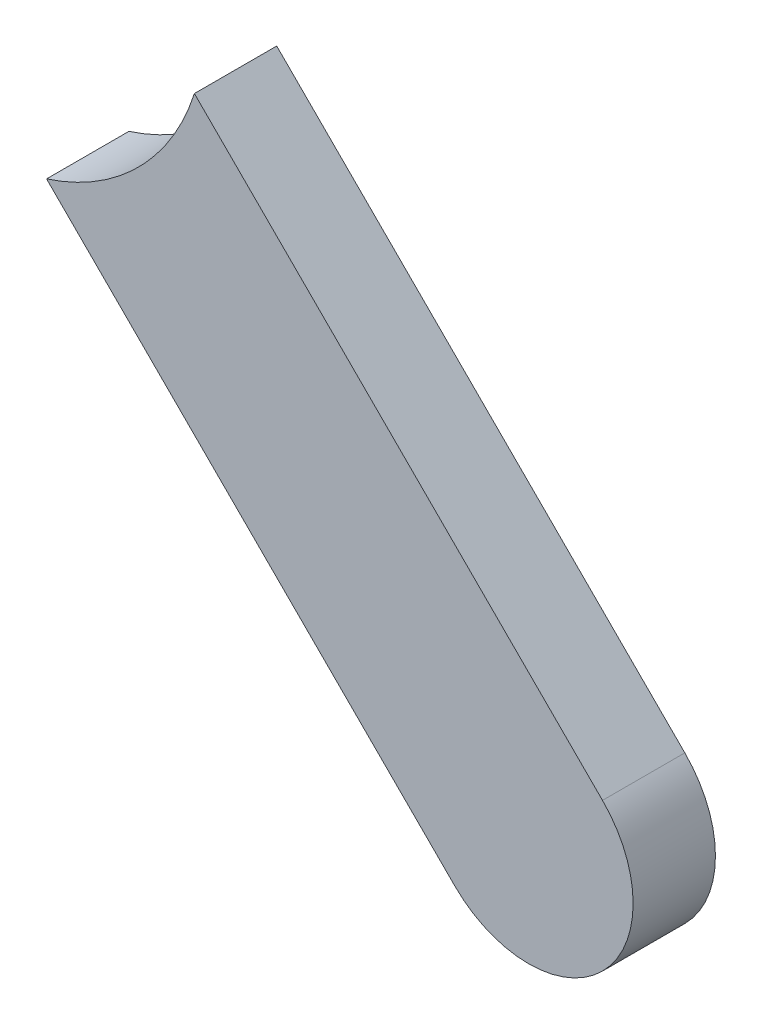
ISO-10303-21;
HEADER;
FILE_DESCRIPTION(('STEP AP214'),'2;1');
FILE_NAME('part.step','',(''),(''),'','','');
FILE_SCHEMA(('AUTOMOTIVE_DESIGN { 1 0 10303 214 1 1 1 1 }'));
ENDSEC;
DATA;
#1=APPLICATION_CONTEXT('core data for automotive mechanical design processes');
#2=APPLICATION_PROTOCOL_DEFINITION('international standard','automotive_design',2000,#1);
#3=PRODUCT_CONTEXT('',#1,'mechanical');
#4=PRODUCT('Part','Part','',(#3));
#5=PRODUCT_RELATED_PRODUCT_CATEGORY('part','',(#4));
#6=PRODUCT_DEFINITION_FORMATION('','',#4);
#7=PRODUCT_DEFINITION_CONTEXT('part definition',#1,'design');
#8=PRODUCT_DEFINITION('design','',#6,#7);
#9=PRODUCT_DEFINITION_SHAPE('','',#8);
#10=(LENGTH_UNIT() NAMED_UNIT(*) SI_UNIT(.MILLI.,.METRE.));
#11=(NAMED_UNIT(*) PLANE_ANGLE_UNIT() SI_UNIT($,.RADIAN.));
#12=(NAMED_UNIT(*) SI_UNIT($,.STERADIAN.) SOLID_ANGLE_UNIT());
#13=UNCERTAINTY_MEASURE_WITH_UNIT(LENGTH_MEASURE(1.E-05),#10,'distance_accuracy_value','');
#14=(GEOMETRIC_REPRESENTATION_CONTEXT(3) GLOBAL_UNCERTAINTY_ASSIGNED_CONTEXT((#13)) GLOBAL_UNIT_ASSIGNED_CONTEXT((#10,
#11,#12)) REPRESENTATION_CONTEXT('',''));
#15=CARTESIAN_POINT('',(0.,0.,0.));
#16=DIRECTION('',(0.,0.,1.));
#17=DIRECTION('',(1.,0.,0.));
#18=AXIS2_PLACEMENT_3D('',#15,#16,#17);
#19=CARTESIAN_POINT('',(149.140329064847,75.1604643951531,0.));
#20=DIRECTION('',(0.707106781186548,0.707106781186548,0.));
#21=DIRECTION('',(0.707106781186548,-0.707106781186548,0.));
#22=AXIS2_PLACEMENT_3D('',#19,#20,#21);
#23=PLANE('',#22);
#24=DIRECTION('',(0.707106781186548,-0.707106781186548,0.));
#25=VECTOR('',#24,1.);
#26=CARTESIAN_POINT('',(148.79139406,75.5093994,0.1999996));
#27=LINE('',#26,#25);
#28=CARTESIAN_POINT('',(149.140329064847,75.1604643951531,0.1999996));
#29=VERTEX_POINT('',#28);
#30=CARTESIAN_POINT('',(150.131907,74.16888646,0.1999996));
#31=VERTEX_POINT('',#30);
#32=EDGE_CURVE('E11',#29,#31,#27,.T.);
#33=ORIENTED_EDGE('',*,*,#32,.F.);
#34=DIRECTION('',(0.,0.,1.));
#35=VECTOR('',#34,1.);
#36=CARTESIAN_POINT('',(149.140329064847,75.1604643951531,0.));
#37=LINE('',#36,#35);
#38=CARTESIAN_POINT('',(149.140329064847,75.1604643951531,0.));
#39=VERTEX_POINT('',#38);
#40=EDGE_CURVE('E24',#39,#29,#37,.T.);
#41=ORIENTED_EDGE('',*,*,#40,.F.);
#42=DIRECTION('',(0.707106781186548,-0.707106781186548,0.));
#43=VECTOR('',#42,1.);
#44=CARTESIAN_POINT('',(148.79139406,75.5093994,0.));
#45=LINE('',#44,#43);
#46=CARTESIAN_POINT('',(150.131907,74.16888646,0.));
#47=VERTEX_POINT('',#46);
#48=EDGE_CURVE('E75',#39,#47,#45,.T.);
#49=ORIENTED_EDGE('',*,*,#48,.T.);
#50=DIRECTION('',(0.,0.,1.));
#51=VECTOR('',#50,1.);
#52=CARTESIAN_POINT('',(150.131907,74.16888646,0.));
#53=LINE('',#52,#51);
#54=EDGE_CURVE('E37',#47,#31,#53,.T.);
#55=ORIENTED_EDGE('',*,*,#54,.T.);
#56=EDGE_LOOP('',(#33,#41,#49,#55));
#57=FACE_BOUND('',#56,.T.);
#58=ADVANCED_FACE('F17',(#57),#23,.F.);
#59=CARTESIAN_POINT('',(150.31151167,74.34849113,0.));
#60=DIRECTION('',(0.,0.,-1.));
#61=DIRECTION('',(-0.707106781186548,-0.707106781186548,0.));
#62=AXIS2_PLACEMENT_3D('',#59,#60,#61);
#63=CYLINDRICAL_SURFACE('',#62,0.253999360179549);
#64=CARTESIAN_POINT('',(150.31151167,74.34849113,0.1999996));
#65=DIRECTION('',(0.,0.,1.));
#66=DIRECTION('',(-0.707106781186548,-0.707106781186548,0.));
#67=AXIS2_PLACEMENT_3D('',#64,#65,#66);
#68=CIRCLE('',#67,0.253999360179549);
#69=CARTESIAN_POINT('',(150.49111634,74.5280958,0.1999996));
#70=VERTEX_POINT('',#69);
#71=EDGE_CURVE('E83',#31,#70,#68,.T.);
#72=ORIENTED_EDGE('',*,*,#71,.F.);
#73=ORIENTED_EDGE('',*,*,#54,.F.);
#74=CARTESIAN_POINT('',(150.31151167,74.34849113,0.));
#75=DIRECTION('',(0.,0.,1.));
#76=DIRECTION('',(-0.707106781186548,-0.707106781186548,0.));
#77=AXIS2_PLACEMENT_3D('',#74,#75,#76);
#78=CIRCLE('',#77,0.253999360179549);
#79=CARTESIAN_POINT('',(150.49111634,74.5280958,0.));
#80=VERTEX_POINT('',#79);
#81=EDGE_CURVE('E81',#47,#80,#78,.T.);
#82=ORIENTED_EDGE('',*,*,#81,.T.);
#83=DIRECTION('',(0.,0.,1.));
#84=VECTOR('',#83,1.);
#85=CARTESIAN_POINT('',(150.49111634,74.5280958,0.));
#86=LINE('',#85,#84);
#87=EDGE_CURVE('E67',#80,#70,#86,.T.);
#88=ORIENTED_EDGE('',*,*,#87,.T.);
#89=EDGE_LOOP('',(#72,#73,#82,#88));
#90=FACE_BOUND('',#89,.T.);
#91=ADVANCED_FACE('F89',(#90),#63,.T.);
#92=CARTESIAN_POINT('',(150.49111634,74.5280958,0.));
#93=DIRECTION('',(-0.707106781186548,-0.707106781186548,0.));
#94=DIRECTION('',(-0.707106781186548,0.707106781186548,0.));
#95=AXIS2_PLACEMENT_3D('',#92,#93,#94);
#96=PLANE('',#95);
#97=DIRECTION('',(-0.707106781186548,0.707106781186548,0.));
#98=VECTOR('',#97,1.);
#99=CARTESIAN_POINT('',(150.49111634,74.5280958,0.1999996));
#100=LINE('',#99,#98);
#101=CARTESIAN_POINT('',(149.499538404847,75.5196737351531,0.1999996));
#102=VERTEX_POINT('',#101);
#103=EDGE_CURVE('E71',#70,#102,#100,.T.);
#104=ORIENTED_EDGE('',*,*,#103,.F.);
#105=ORIENTED_EDGE('',*,*,#87,.F.);
#106=DIRECTION('',(-0.707106781186548,0.707106781186548,0.));
#107=VECTOR('',#106,1.);
#108=CARTESIAN_POINT('',(150.49111634,74.5280958,0.));
#109=LINE('',#108,#107);
#110=CARTESIAN_POINT('',(149.499538404847,75.5196737351531,0.));
#111=VERTEX_POINT('',#110);
#112=EDGE_CURVE('E63',#80,#111,#109,.T.);
#113=ORIENTED_EDGE('',*,*,#112,.T.);
#114=DIRECTION('',(0.,0.,1.));
#115=VECTOR('',#114,1.);
#116=CARTESIAN_POINT('',(149.499538404847,75.5196737351531,0.));
#117=LINE('',#116,#115);
#118=EDGE_CURVE('E53',#111,#102,#117,.T.);
#119=ORIENTED_EDGE('',*,*,#118,.T.);
#120=EDGE_LOOP('',(#104,#105,#113,#119));
#121=FACE_BOUND('',#120,.T.);
#122=ADVANCED_FACE('F66',(#121),#96,.F.);
#123=CARTESIAN_POINT('',(148.971,75.6890028,0.));
#124=DIRECTION('',(0.,0.,-1.));
#125=DIRECTION('',(1.,0.,0.));
#126=AXIS2_PLACEMENT_3D('',#123,#124,#125);
#127=CYLINDRICAL_SURFACE('',#126,0.55500016);
#128=ORIENTED_EDGE('',*,*,#40,.T.);
#129=CARTESIAN_POINT('',(148.971,75.6890028,0.1999996));
#130=DIRECTION('',(0.,0.,1.));
#131=DIRECTION('',(1.,0.,0.));
#132=AXIS2_PLACEMENT_3D('',#129,#130,#131);
#133=CIRCLE('',#132,0.55500016);
#134=EDGE_CURVE('E59',#29,#102,#133,.T.);
#135=ORIENTED_EDGE('',*,*,#134,.T.);
#136=ORIENTED_EDGE('',*,*,#118,.F.);
#137=CARTESIAN_POINT('',(148.971,75.6890028,0.));
#138=DIRECTION('',(0.,0.,1.));
#139=DIRECTION('',(1.,0.,0.));
#140=AXIS2_PLACEMENT_3D('',#137,#138,#139);
#141=CIRCLE('',#140,0.55500016);
#142=EDGE_CURVE('E57',#39,#111,#141,.T.);
#143=ORIENTED_EDGE('',*,*,#142,.F.);
#144=EDGE_LOOP('',(#128,#135,#136,#143));
#145=FACE_BOUND('',#144,.T.);
#146=ADVANCED_FACE('F55',(#145),#127,.F.);
#147=CARTESIAN_POINT('',(148.79139406,75.5093994,0.));
#148=DIRECTION('',(0.,0.,-1.));
#149=DIRECTION('',(-1.,0.,0.));
#150=AXIS2_PLACEMENT_3D('',#147,#148,#149);
#151=PLANE('',#150);
#152=ORIENTED_EDGE('',*,*,#48,.F.);
#153=ORIENTED_EDGE('',*,*,#142,.T.);
#154=ORIENTED_EDGE('',*,*,#112,.F.);
#155=ORIENTED_EDGE('',*,*,#81,.F.);
#156=EDGE_LOOP('',(#152,#153,#154,#155));
#157=FACE_BOUND('',#156,.T.);
#158=ADVANCED_FACE('F74',(#157),#151,.T.);
#159=CARTESIAN_POINT('',(148.79139406,75.5093994,0.1999996));
#160=DIRECTION('',(0.,0.,-1.));
#161=DIRECTION('',(-1.,0.,0.));
#162=AXIS2_PLACEMENT_3D('',#159,#160,#161);
#163=PLANE('',#162);
#164=ORIENTED_EDGE('',*,*,#134,.F.);
#165=ORIENTED_EDGE('',*,*,#32,.T.);
#166=ORIENTED_EDGE('',*,*,#71,.T.);
#167=ORIENTED_EDGE('',*,*,#103,.T.);
#168=EDGE_LOOP('',(#164,#165,#166,#167));
#169=FACE_BOUND('',#168,.T.);
#170=ADVANCED_FACE('F91',(#169),#163,.F.);
#171=CLOSED_SHELL('',(#58,#91,#122,#146,#158,#170));
#172=MANIFOLD_SOLID_BREP('B1',#171);
#173=ADVANCED_BREP_SHAPE_REPRESENTATION('',(#18,#172),#14);
#174=SHAPE_DEFINITION_REPRESENTATION(#9,#173);
ENDSEC;
END-ISO-10303-21;
